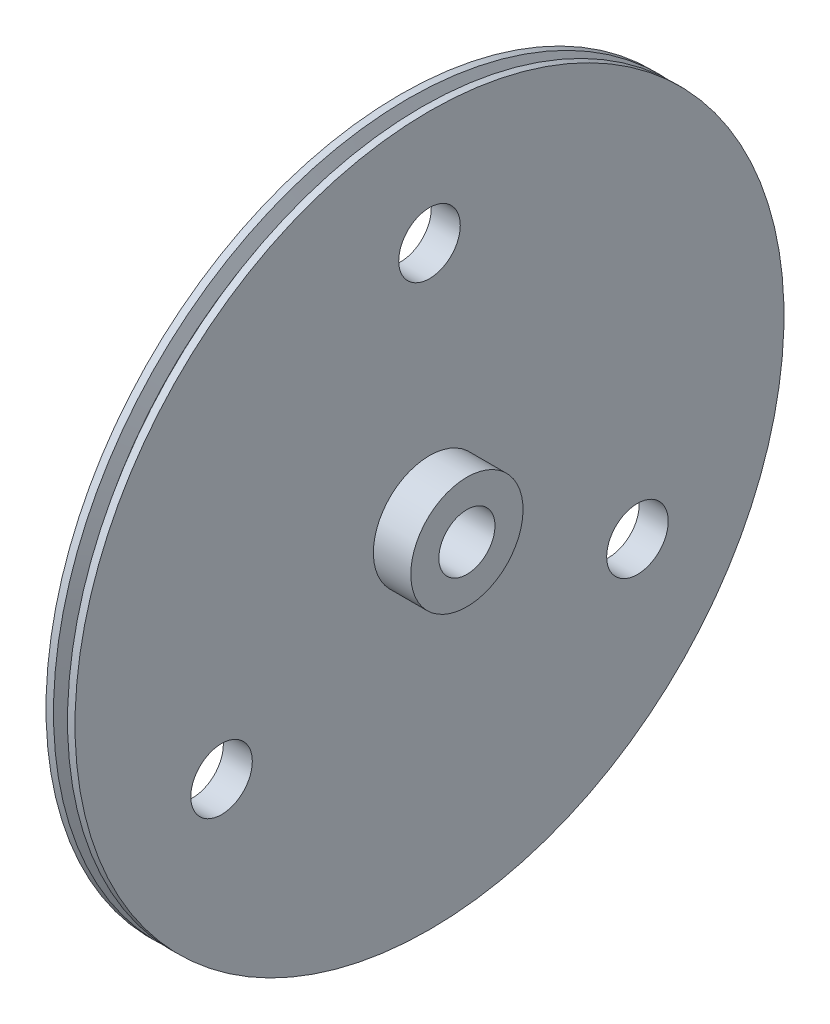
ISO-10303-21;
HEADER;
FILE_DESCRIPTION(('STEP AP214'),'2;1');
FILE_NAME('part.step','',(''),(''),'','','');
FILE_SCHEMA(('AUTOMOTIVE_DESIGN { 1 0 10303 214 1 1 1 1 }'));
ENDSEC;
DATA;
#1=APPLICATION_CONTEXT('core data for automotive mechanical design processes');
#2=APPLICATION_PROTOCOL_DEFINITION('international standard','automotive_design',2000,#1);
#3=PRODUCT_CONTEXT('',#1,'mechanical');
#4=PRODUCT('Part','Part','',(#3));
#5=PRODUCT_RELATED_PRODUCT_CATEGORY('part','',(#4));
#6=PRODUCT_DEFINITION_FORMATION('','',#4);
#7=PRODUCT_DEFINITION_CONTEXT('part definition',#1,'design');
#8=PRODUCT_DEFINITION('design','',#6,#7);
#9=PRODUCT_DEFINITION_SHAPE('','',#8);
#10=(LENGTH_UNIT() NAMED_UNIT(*) SI_UNIT(.MILLI.,.METRE.));
#11=(NAMED_UNIT(*) PLANE_ANGLE_UNIT() SI_UNIT($,.RADIAN.));
#12=(NAMED_UNIT(*) SI_UNIT($,.STERADIAN.) SOLID_ANGLE_UNIT());
#13=UNCERTAINTY_MEASURE_WITH_UNIT(LENGTH_MEASURE(1.E-05),#10,'distance_accuracy_value','');
#14=(GEOMETRIC_REPRESENTATION_CONTEXT(3) GLOBAL_UNCERTAINTY_ASSIGNED_CONTEXT((#13)) GLOBAL_UNIT_ASSIGNED_CONTEXT((#10,
#11,#12)) REPRESENTATION_CONTEXT('',''));
#15=CARTESIAN_POINT('',(0.,0.,0.));
#16=DIRECTION('',(0.,0.,1.));
#17=DIRECTION('',(1.,0.,0.));
#18=AXIS2_PLACEMENT_3D('',#15,#16,#17);
#19=CARTESIAN_POINT('',(0.,0.,0.));
#20=DIRECTION('',(-1.,0.,0.));
#21=DIRECTION('',(0.,-1.,0.));
#22=AXIS2_PLACEMENT_3D('',#19,#20,#21);
#23=PLANE('',#22);
#24=CARTESIAN_POINT('',(0.,163.02280596175,0.));
#25=DIRECTION('',(-1.,0.,0.));
#26=DIRECTION('',(0.,-1.,0.));
#27=AXIS2_PLACEMENT_3D('',#24,#25,#26);
#28=CIRCLE('',#27,20.8935028450527);
#29=CARTESIAN_POINT('',(0.,142.129303116697,0.));
#30=VERTEX_POINT('',#29);
#31=EDGE_CURVE('E54',#30,#30,#28,.T.);
#32=ORIENTED_EDGE('',*,*,#31,.F.);
#33=EDGE_LOOP('',(#32));
#34=FACE_BOUND('',#33,.T.);
#35=CARTESIAN_POINT('',(0.,-81.511402980869,141.181891359107));
#36=DIRECTION('',(-1.,0.,0.));
#37=DIRECTION('',(0.,-1.,0.));
#38=AXIS2_PLACEMENT_3D('',#35,#36,#37);
#39=CIRCLE('',#38,20.8935028450618);
#40=CARTESIAN_POINT('',(0.,-102.404905825931,141.181891359107));
#41=VERTEX_POINT('',#40);
#42=EDGE_CURVE('E112',#41,#41,#39,.T.);
#43=ORIENTED_EDGE('',*,*,#42,.F.);
#44=EDGE_LOOP('',(#43));
#45=FACE_BOUND('',#44,.T.);
#46=CARTESIAN_POINT('',(0.,-81.5114029808811,-141.181891359087));
#47=DIRECTION('',(-1.,0.,0.));
#48=DIRECTION('',(0.,-1.,0.));
#49=AXIS2_PLACEMENT_3D('',#46,#47,#48);
#50=CIRCLE('',#49,20.8935028450659);
#51=CARTESIAN_POINT('',(0.,-102.404905825947,-141.181891359087));
#52=VERTEX_POINT('',#51);
#53=EDGE_CURVE('E116',#52,#52,#50,.T.);
#54=ORIENTED_EDGE('',*,*,#53,.F.);
#55=EDGE_LOOP('',(#54));
#56=FACE_BOUND('',#55,.T.);
#57=CARTESIAN_POINT('',(0.,0.,0.));
#58=DIRECTION('',(1.,0.,0.));
#59=DIRECTION('',(0.,1.,0.));
#60=AXIS2_PLACEMENT_3D('',#57,#58,#59);
#61=CIRCLE('',#60,19.05);
#62=CARTESIAN_POINT('',(0.,19.05,0.));
#63=VERTEX_POINT('',#62);
#64=EDGE_CURVE('E63',#63,#63,#61,.T.);
#65=ORIENTED_EDGE('',*,*,#64,.T.);
#66=EDGE_LOOP('',(#65));
#67=FACE_BOUND('',#66,.T.);
#68=CARTESIAN_POINT('',(0.,0.,0.));
#69=DIRECTION('',(1.,0.,0.));
#70=DIRECTION('',(0.,1.,0.));
#71=AXIS2_PLACEMENT_3D('',#68,#69,#70);
#72=CIRCLE('',#71,240.665);
#73=CARTESIAN_POINT('',(0.,240.665,0.));
#74=VERTEX_POINT('',#73);
#75=EDGE_CURVE('E10',#74,#74,#72,.T.);
#76=ORIENTED_EDGE('',*,*,#75,.F.);
#77=EDGE_LOOP('',(#76));
#78=FACE_BOUND('',#77,.T.);
#79=ADVANCED_FACE('F35',(#34,#45,#56,#67,#78),#23,.T.);
#80=CARTESIAN_POINT('',(45.085,0.,0.));
#81=DIRECTION('',(1.,0.,0.));
#82=DIRECTION('',(0.,1.,0.));
#83=AXIS2_PLACEMENT_3D('',#80,#81,#82);
#84=CYLINDRICAL_SURFACE('',#83,240.665);
#85=ORIENTED_EDGE('',*,*,#75,.T.);
#86=EDGE_LOOP('',(#85));
#87=FACE_BOUND('',#86,.T.);
#88=CARTESIAN_POINT('',(5.07999999999995,0.,0.));
#89=DIRECTION('',(1.,0.,0.));
#90=DIRECTION('',(0.,1.,0.));
#91=AXIS2_PLACEMENT_3D('',#88,#89,#90);
#92=CIRCLE('',#91,240.665);
#93=CARTESIAN_POINT('',(5.08,240.665,0.));
#94=VERTEX_POINT('',#93);
#95=EDGE_CURVE('E42',#94,#94,#92,.T.);
#96=ORIENTED_EDGE('',*,*,#95,.F.);
#97=EDGE_LOOP('',(#96));
#98=FACE_BOUND('',#97,.T.);
#99=ADVANCED_FACE('F93',(#87,#98),#84,.T.);
#100=CARTESIAN_POINT('',(8.78131703660527,0.,0.));
#101=DIRECTION('',(-1.,0.,0.));
#102=DIRECTION('',(0.,-1.,0.));
#103=AXIS2_PLACEMENT_3D('',#100,#101,#102);
#104=CONICAL_SURFACE('',#103,232.7275,1.13446401379631);
#105=ORIENTED_EDGE('',*,*,#95,.T.);
#106=EDGE_LOOP('',(#105));
#107=FACE_BOUND('',#106,.T.);
#108=CARTESIAN_POINT('',(8.78131703660527,0.,0.));
#109=DIRECTION('',(1.,0.,0.));
#110=DIRECTION('',(0.,1.,0.));
#111=AXIS2_PLACEMENT_3D('',#108,#109,#110);
#112=CIRCLE('',#111,232.7275);
#113=CARTESIAN_POINT('',(8.78131703660532,232.7275,0.));
#114=VERTEX_POINT('',#113);
#115=EDGE_CURVE('E47',#114,#114,#112,.T.);
#116=ORIENTED_EDGE('',*,*,#115,.F.);
#117=EDGE_LOOP('',(#116));
#118=FACE_BOUND('',#117,.T.);
#119=ADVANCED_FACE('F91',(#107,#118),#104,.T.);
#120=CARTESIAN_POINT('',(45.085,0.,0.));
#121=DIRECTION('',(1.,0.,0.));
#122=DIRECTION('',(0.,1.,0.));
#123=AXIS2_PLACEMENT_3D('',#120,#121,#122);
#124=CYLINDRICAL_SURFACE('',#123,232.7275);
#125=ORIENTED_EDGE('',*,*,#115,.T.);
#126=EDGE_LOOP('',(#125));
#127=FACE_BOUND('',#126,.T.);
#128=CARTESIAN_POINT('',(10.9036829633946,0.,0.));
#129=DIRECTION('',(1.,0.,0.));
#130=DIRECTION('',(0.,1.,0.));
#131=AXIS2_PLACEMENT_3D('',#128,#129,#130);
#132=CIRCLE('',#131,232.7275);
#133=CARTESIAN_POINT('',(10.9036829633947,232.7275,0.));
#134=VERTEX_POINT('',#133);
#135=EDGE_CURVE('E83',#134,#134,#132,.T.);
#136=ORIENTED_EDGE('',*,*,#135,.F.);
#137=EDGE_LOOP('',(#136));
#138=FACE_BOUND('',#137,.T.);
#139=ADVANCED_FACE('F88',(#127,#138),#124,.T.);
#140=CARTESIAN_POINT('',(14.6049999999999,0.,0.));
#141=DIRECTION('',(1.,0.,0.));
#142=DIRECTION('',(0.,1.,0.));
#143=AXIS2_PLACEMENT_3D('',#140,#141,#142);
#144=CONICAL_SURFACE('',#143,240.665,1.13446401379631);
#145=ORIENTED_EDGE('',*,*,#135,.T.);
#146=EDGE_LOOP('',(#145));
#147=FACE_BOUND('',#146,.T.);
#148=CARTESIAN_POINT('',(14.6049999999999,0.,0.));
#149=DIRECTION('',(1.,0.,0.));
#150=DIRECTION('',(0.,1.,0.));
#151=AXIS2_PLACEMENT_3D('',#148,#149,#150);
#152=CIRCLE('',#151,240.665);
#153=CARTESIAN_POINT('',(14.605,240.665,0.));
#154=VERTEX_POINT('',#153);
#155=EDGE_CURVE('E80',#154,#154,#152,.T.);
#156=ORIENTED_EDGE('',*,*,#155,.F.);
#157=EDGE_LOOP('',(#156));
#158=FACE_BOUND('',#157,.T.);
#159=ADVANCED_FACE('F100',(#147,#158),#144,.T.);
#160=CARTESIAN_POINT('',(45.085,0.,0.));
#161=DIRECTION('',(1.,0.,0.));
#162=DIRECTION('',(0.,1.,0.));
#163=AXIS2_PLACEMENT_3D('',#160,#161,#162);
#164=CYLINDRICAL_SURFACE('',#163,240.665);
#165=ORIENTED_EDGE('',*,*,#155,.T.);
#166=EDGE_LOOP('',(#165));
#167=FACE_BOUND('',#166,.T.);
#168=CARTESIAN_POINT('',(19.6849999999999,0.,0.));
#169=DIRECTION('',(1.,0.,0.));
#170=DIRECTION('',(0.,1.,0.));
#171=AXIS2_PLACEMENT_3D('',#168,#169,#170);
#172=CIRCLE('',#171,240.665);
#173=CARTESIAN_POINT('',(19.685,240.665,0.));
#174=VERTEX_POINT('',#173);
#175=EDGE_CURVE('E77',#174,#174,#172,.T.);
#176=ORIENTED_EDGE('',*,*,#175,.F.);
#177=EDGE_LOOP('',(#176));
#178=FACE_BOUND('',#177,.T.);
#179=ADVANCED_FACE('F143',(#167,#178),#164,.T.);
#180=CARTESIAN_POINT('',(19.685,240.665,0.));
#181=DIRECTION('',(1.,0.,0.));
#182=DIRECTION('',(0.,1.,0.));
#183=AXIS2_PLACEMENT_3D('',#180,#181,#182);
#184=PLANE('',#183);
#185=CARTESIAN_POINT('',(19.685,163.02280596175,0.));
#186=DIRECTION('',(1.,0.,0.));
#187=DIRECTION('',(0.,1.,0.));
#188=AXIS2_PLACEMENT_3D('',#185,#186,#187);
#189=CIRCLE('',#188,20.8935028450527);
#190=CARTESIAN_POINT('',(19.685,183.916308806803,0.));
#191=VERTEX_POINT('',#190);
#192=EDGE_CURVE('E38',#191,#191,#189,.T.);
#193=ORIENTED_EDGE('',*,*,#192,.F.);
#194=EDGE_LOOP('',(#193));
#195=FACE_BOUND('',#194,.T.);
#196=CARTESIAN_POINT('',(19.685,-81.511402980869,141.181891359107));
#197=DIRECTION('',(1.,0.,0.));
#198=DIRECTION('',(0.,1.,0.));
#199=AXIS2_PLACEMENT_3D('',#196,#197,#198);
#200=CIRCLE('',#199,20.8935028450618);
#201=CARTESIAN_POINT('',(19.685,-60.6179001358072,141.181891359107));
#202=VERTEX_POINT('',#201);
#203=EDGE_CURVE('E53',#202,#202,#200,.T.);
#204=ORIENTED_EDGE('',*,*,#203,.F.);
#205=EDGE_LOOP('',(#204));
#206=FACE_BOUND('',#205,.T.);
#207=CARTESIAN_POINT('',(19.685,-81.5114029808812,-141.181891359087));
#208=DIRECTION('',(1.,0.,0.));
#209=DIRECTION('',(0.,1.,0.));
#210=AXIS2_PLACEMENT_3D('',#207,#208,#209);
#211=CIRCLE('',#210,20.8935028450659);
#212=CARTESIAN_POINT('',(19.685,-60.6179001358153,-141.181891359087));
#213=VERTEX_POINT('',#212);
#214=EDGE_CURVE('E51',#213,#213,#211,.T.);
#215=ORIENTED_EDGE('',*,*,#214,.F.);
#216=EDGE_LOOP('',(#215));
#217=FACE_BOUND('',#216,.T.);
#218=ORIENTED_EDGE('',*,*,#175,.T.);
#219=EDGE_LOOP('',(#218));
#220=FACE_BOUND('',#219,.T.);
#221=CARTESIAN_POINT('',(19.685,0.,0.));
#222=DIRECTION('',(1.,0.,0.));
#223=DIRECTION('',(0.,1.,0.));
#224=AXIS2_PLACEMENT_3D('',#221,#222,#223);
#225=CIRCLE('',#224,38.1);
#226=CARTESIAN_POINT('',(19.685,38.1,0.));
#227=VERTEX_POINT('',#226);
#228=EDGE_CURVE('E74',#227,#227,#225,.T.);
#229=ORIENTED_EDGE('',*,*,#228,.F.);
#230=EDGE_LOOP('',(#229));
#231=FACE_BOUND('',#230,.T.);
#232=ADVANCED_FACE('F139',(#195,#206,#217,#220,#231),#184,.T.);
#233=CARTESIAN_POINT('',(45.085,0.,0.));
#234=DIRECTION('',(1.,0.,0.));
#235=DIRECTION('',(0.,1.,0.));
#236=AXIS2_PLACEMENT_3D('',#233,#234,#235);
#237=CYLINDRICAL_SURFACE('',#236,38.1);
#238=ORIENTED_EDGE('',*,*,#228,.T.);
#239=EDGE_LOOP('',(#238));
#240=FACE_BOUND('',#239,.T.);
#241=CARTESIAN_POINT('',(45.085,0.,0.));
#242=DIRECTION('',(1.,0.,0.));
#243=DIRECTION('',(0.,1.,0.));
#244=AXIS2_PLACEMENT_3D('',#241,#242,#243);
#245=CIRCLE('',#244,38.1);
#246=CARTESIAN_POINT('',(45.085,38.1,0.));
#247=VERTEX_POINT('',#246);
#248=EDGE_CURVE('E68',#247,#247,#245,.T.);
#249=ORIENTED_EDGE('',*,*,#248,.F.);
#250=EDGE_LOOP('',(#249));
#251=FACE_BOUND('',#250,.T.);
#252=ADVANCED_FACE('F132',(#240,#251),#237,.T.);
#253=CARTESIAN_POINT('',(45.085,38.1,0.));
#254=DIRECTION('',(1.,0.,0.));
#255=DIRECTION('',(0.,1.,0.));
#256=AXIS2_PLACEMENT_3D('',#253,#254,#255);
#257=PLANE('',#256);
#258=CARTESIAN_POINT('',(45.085,0.,0.));
#259=DIRECTION('',(1.,0.,0.));
#260=DIRECTION('',(0.,1.,0.));
#261=AXIS2_PLACEMENT_3D('',#258,#259,#260);
#262=CIRCLE('',#261,19.05);
#263=CARTESIAN_POINT('',(45.085,19.05,0.));
#264=VERTEX_POINT('',#263);
#265=EDGE_CURVE('E59',#264,#264,#262,.T.);
#266=ORIENTED_EDGE('',*,*,#265,.F.);
#267=EDGE_LOOP('',(#266));
#268=FACE_BOUND('',#267,.T.);
#269=ORIENTED_EDGE('',*,*,#248,.T.);
#270=EDGE_LOOP('',(#269));
#271=FACE_BOUND('',#270,.T.);
#272=ADVANCED_FACE('F123',(#268,#271),#257,.T.);
#273=CARTESIAN_POINT('',(0.,0.,0.));
#274=DIRECTION('',(1.,0.,0.));
#275=DIRECTION('',(0.,1.,0.));
#276=AXIS2_PLACEMENT_3D('',#273,#274,#275);
#277=CYLINDRICAL_SURFACE('',#276,19.05);
#278=ORIENTED_EDGE('',*,*,#64,.F.);
#279=EDGE_LOOP('',(#278));
#280=FACE_BOUND('',#279,.T.);
#281=ORIENTED_EDGE('',*,*,#265,.T.);
#282=EDGE_LOOP('',(#281));
#283=FACE_BOUND('',#282,.T.);
#284=ADVANCED_FACE('F120',(#280,#283),#277,.F.);
#285=CARTESIAN_POINT('',(45.0850000000001,-81.5114029808812,-141.181891359087));
#286=DIRECTION('',(-1.,0.,0.));
#287=DIRECTION('',(0.,-1.,0.));
#288=AXIS2_PLACEMENT_3D('',#285,#286,#287);
#289=CYLINDRICAL_SURFACE('',#288,20.8935028450659);
#290=ORIENTED_EDGE('',*,*,#214,.T.);
#291=EDGE_LOOP('',(#290));
#292=FACE_BOUND('',#291,.T.);
#293=ORIENTED_EDGE('',*,*,#53,.T.);
#294=EDGE_LOOP('',(#293));
#295=FACE_BOUND('',#294,.T.);
#296=ADVANCED_FACE('F122',(#292,#295),#289,.F.);
#297=CARTESIAN_POINT('',(45.0850000000001,-81.511402980869,141.181891359107));
#298=DIRECTION('',(-1.,0.,0.));
#299=DIRECTION('',(0.,-1.,0.));
#300=AXIS2_PLACEMENT_3D('',#297,#298,#299);
#301=CYLINDRICAL_SURFACE('',#300,20.8935028450618);
#302=ORIENTED_EDGE('',*,*,#203,.T.);
#303=EDGE_LOOP('',(#302));
#304=FACE_BOUND('',#303,.T.);
#305=ORIENTED_EDGE('',*,*,#42,.T.);
#306=EDGE_LOOP('',(#305));
#307=FACE_BOUND('',#306,.T.);
#308=ADVANCED_FACE('F129',(#304,#307),#301,.F.);
#309=CARTESIAN_POINT('',(45.0850000000001,163.02280596175,0.));
#310=DIRECTION('',(-1.,0.,0.));
#311=DIRECTION('',(0.,-1.,0.));
#312=AXIS2_PLACEMENT_3D('',#309,#310,#311);
#313=CYLINDRICAL_SURFACE('',#312,20.8935028450527);
#314=ORIENTED_EDGE('',*,*,#192,.T.);
#315=EDGE_LOOP('',(#314));
#316=FACE_BOUND('',#315,.T.);
#317=ORIENTED_EDGE('',*,*,#31,.T.);
#318=EDGE_LOOP('',(#317));
#319=FACE_BOUND('',#318,.T.);
#320=ADVANCED_FACE('F245',(#316,#319),#313,.F.);
#321=CLOSED_SHELL('',(#79,#99,#119,#139,#159,#179,#232,#252,#272,#284,#296,#308,#320));
#322=MANIFOLD_SOLID_BREP('B2',#321);
#323=ADVANCED_BREP_SHAPE_REPRESENTATION('',(#18,#322),#14);
#324=SHAPE_DEFINITION_REPRESENTATION(#9,#323);
ENDSEC;
END-ISO-10303-21;
